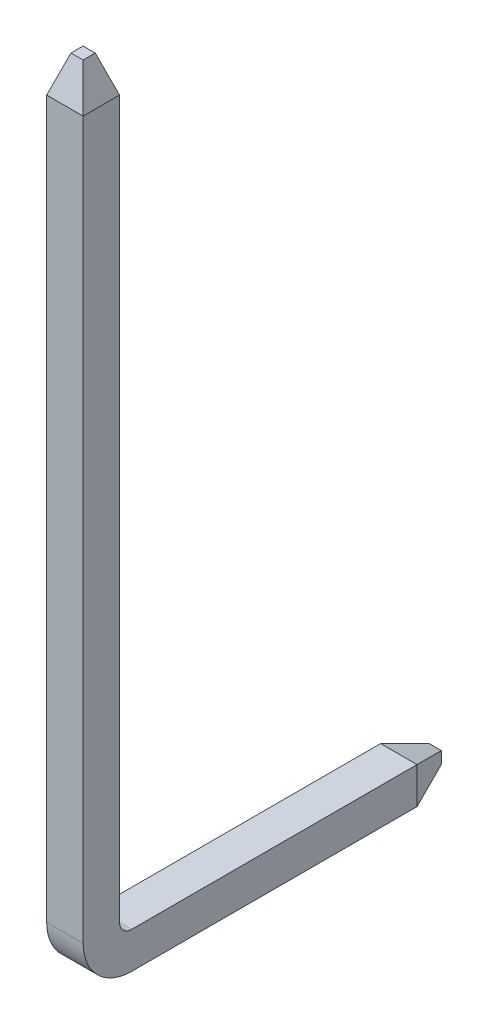
ISO-10303-21;
HEADER;
FILE_DESCRIPTION(('STEP AP214'),'2;1');
FILE_NAME('part.step','',(''),(''),'','','');
FILE_SCHEMA(('AUTOMOTIVE_DESIGN { 1 0 10303 214 1 1 1 1 }'));
ENDSEC;
DATA;
#1=APPLICATION_CONTEXT('core data for automotive mechanical design processes');
#2=APPLICATION_PROTOCOL_DEFINITION('international standard','automotive_design',2000,#1);
#3=PRODUCT_CONTEXT('',#1,'mechanical');
#4=PRODUCT('Part','Part','',(#3));
#5=PRODUCT_RELATED_PRODUCT_CATEGORY('part','',(#4));
#6=PRODUCT_DEFINITION_FORMATION('','',#4);
#7=PRODUCT_DEFINITION_CONTEXT('part definition',#1,'design');
#8=PRODUCT_DEFINITION('design','',#6,#7);
#9=PRODUCT_DEFINITION_SHAPE('','',#8);
#10=(LENGTH_UNIT() NAMED_UNIT(*) SI_UNIT(.MILLI.,.METRE.));
#11=(NAMED_UNIT(*) PLANE_ANGLE_UNIT() SI_UNIT($,.RADIAN.));
#12=(NAMED_UNIT(*) SI_UNIT($,.STERADIAN.) SOLID_ANGLE_UNIT());
#13=UNCERTAINTY_MEASURE_WITH_UNIT(LENGTH_MEASURE(1.E-05),#10,'distance_accuracy_value','');
#14=(GEOMETRIC_REPRESENTATION_CONTEXT(3) GLOBAL_UNCERTAINTY_ASSIGNED_CONTEXT((#13)) GLOBAL_UNIT_ASSIGNED_CONTEXT((#10,
#11,#12)) REPRESENTATION_CONTEXT('',''));
#15=CARTESIAN_POINT('',(0.,0.,0.));
#16=DIRECTION('',(0.,0.,1.));
#17=DIRECTION('',(1.,0.,0.));
#18=AXIS2_PLACEMENT_3D('',#15,#16,#17);
#19=CARTESIAN_POINT('',(0.6,12.6,0.));
#20=DIRECTION('',(0.,-1.,0.));
#21=DIRECTION('',(0.,0.,-1.));
#22=AXIS2_PLACEMENT_3D('',#19,#20,#21);
#23=PLANE('',#22);
#24=DIRECTION('',(0.,0.,1.));
#25=VECTOR('',#24,1.);
#26=CARTESIAN_POINT('',(0.2,12.6,0.));
#27=LINE('',#26,#25);
#28=CARTESIAN_POINT('',(0.2,12.6,0.2));
#29=VERTEX_POINT('',#28);
#30=CARTESIAN_POINT('',(0.2,12.6,0.4));
#31=VERTEX_POINT('',#30);
#32=EDGE_CURVE('E58',#29,#31,#27,.T.);
#33=ORIENTED_EDGE('',*,*,#32,.T.);
#34=DIRECTION('',(1.,0.,0.));
#35=VECTOR('',#34,1.);
#36=CARTESIAN_POINT('',(0.6,12.6,0.4));
#37=LINE('',#36,#35);
#38=CARTESIAN_POINT('',(0.4,12.6,0.4));
#39=VERTEX_POINT('',#38);
#40=EDGE_CURVE('E50',#31,#39,#37,.T.);
#41=ORIENTED_EDGE('',*,*,#40,.T.);
#42=DIRECTION('',(0.,0.,-1.));
#43=VECTOR('',#42,1.);
#44=CARTESIAN_POINT('',(0.4,12.6,0.));
#45=LINE('',#44,#43);
#46=CARTESIAN_POINT('',(0.4,12.6,0.2));
#47=VERTEX_POINT('',#46);
#48=EDGE_CURVE('E243',#39,#47,#45,.T.);
#49=ORIENTED_EDGE('',*,*,#48,.T.);
#50=DIRECTION('',(-1.,0.,0.));
#51=VECTOR('',#50,1.);
#52=CARTESIAN_POINT('',(0.6,12.6,0.2));
#53=LINE('',#52,#51);
#54=EDGE_CURVE('E63',#47,#29,#53,.T.);
#55=ORIENTED_EDGE('',*,*,#54,.T.);
#56=EDGE_LOOP('',(#33,#41,#49,#55));
#57=FACE_BOUND('',#56,.T.);
#58=ADVANCED_FACE('F41',(#57),#23,.F.);
#59=CARTESIAN_POINT('',(0.6,12.6,0.6));
#60=DIRECTION('',(0.,0.,-1.));
#61=DIRECTION('',(0.,1.,0.));
#62=AXIS2_PLACEMENT_3D('',#59,#60,#61);
#63=PLANE('',#62);
#64=DIRECTION('',(0.,-1.,0.));
#65=VECTOR('',#64,1.);
#66=CARTESIAN_POINT('',(0.6,12.6,0.6));
#67=LINE('',#66,#65);
#68=CARTESIAN_POINT('',(0.6,12.,0.6));
#69=VERTEX_POINT('',#68);
#70=CARTESIAN_POINT('',(0.6,0.200000000000006,0.599999999999999));
#71=VERTEX_POINT('',#70);
#72=EDGE_CURVE('E142',#69,#71,#67,.T.);
#73=ORIENTED_EDGE('',*,*,#72,.F.);
#74=DIRECTION('',(-1.,0.,0.));
#75=VECTOR('',#74,1.);
#76=CARTESIAN_POINT('',(0.6,12.,0.6));
#77=LINE('',#76,#75);
#78=CARTESIAN_POINT('',(0.,12.,0.6));
#79=VERTEX_POINT('',#78);
#80=EDGE_CURVE('E241',#69,#79,#77,.T.);
#81=ORIENTED_EDGE('',*,*,#80,.T.);
#82=DIRECTION('',(0.,-1.,0.));
#83=VECTOR('',#82,1.);
#84=CARTESIAN_POINT('',(0.,12.6,0.6));
#85=LINE('',#84,#83);
#86=CARTESIAN_POINT('',(0.,0.200000000000006,0.599999999999999));
#87=VERTEX_POINT('',#86);
#88=EDGE_CURVE('E161',#79,#87,#85,.T.);
#89=ORIENTED_EDGE('',*,*,#88,.T.);
#90=DIRECTION('',(-1.,0.,0.));
#91=VECTOR('',#90,1.);
#92=CARTESIAN_POINT('',(0.6,0.200000000000006,0.599999999999999));
#93=LINE('',#92,#91);
#94=EDGE_CURVE('E158',#71,#87,#93,.T.);
#95=ORIENTED_EDGE('',*,*,#94,.F.);
#96=EDGE_LOOP('',(#73,#81,#89,#95));
#97=FACE_BOUND('',#96,.T.);
#98=ADVANCED_FACE('F159',(#97),#63,.F.);
#99=CARTESIAN_POINT('',(0.6,0.2,-0.200000000000001));
#100=DIRECTION('',(-1.,0.,0.));
#101=DIRECTION('',(0.,0.,1.));
#102=AXIS2_PLACEMENT_3D('',#99,#100,#101);
#103=CYLINDRICAL_SURFACE('',#102,0.8);
#104=CARTESIAN_POINT('',(0.,0.2,-0.200000000000001));
#105=DIRECTION('',(1.,0.,0.));
#106=DIRECTION('',(0.,0.,-1.));
#107=AXIS2_PLACEMENT_3D('',#104,#105,#106);
#108=CIRCLE('',#107,0.8);
#109=CARTESIAN_POINT('',(0.,-0.6,-0.200000000000007));
#110=VERTEX_POINT('',#109);
#111=EDGE_CURVE('E187',#87,#110,#108,.T.);
#112=ORIENTED_EDGE('',*,*,#111,.T.);
#113=DIRECTION('',(-1.,0.,0.));
#114=VECTOR('',#113,1.);
#115=CARTESIAN_POINT('',(0.6,-0.6,-0.200000000000007));
#116=LINE('',#115,#114);
#117=CARTESIAN_POINT('',(0.6,-0.6,-0.200000000000007));
#118=VERTEX_POINT('',#117);
#119=EDGE_CURVE('E166',#118,#110,#116,.T.);
#120=ORIENTED_EDGE('',*,*,#119,.F.);
#121=CARTESIAN_POINT('',(0.6,0.2,-0.200000000000001));
#122=DIRECTION('',(1.,0.,0.));
#123=DIRECTION('',(0.,0.,-1.));
#124=AXIS2_PLACEMENT_3D('',#121,#122,#123);
#125=CIRCLE('',#124,0.8);
#126=EDGE_CURVE('E147',#71,#118,#125,.T.);
#127=ORIENTED_EDGE('',*,*,#126,.F.);
#128=ORIENTED_EDGE('',*,*,#94,.T.);
#129=EDGE_LOOP('',(#112,#120,#127,#128));
#130=FACE_BOUND('',#129,.T.);
#131=ADVANCED_FACE('F168',(#130),#103,.T.);
#132=CARTESIAN_POINT('',(0.6,-0.6,-0.200000000000007));
#133=DIRECTION('',(0.,1.,0.));
#134=DIRECTION('',(0.,0.,1.));
#135=AXIS2_PLACEMENT_3D('',#132,#133,#134);
#136=PLANE('',#135);
#137=DIRECTION('',(0.,0.,-1.));
#138=VECTOR('',#137,1.);
#139=CARTESIAN_POINT('',(0.,-0.6,-0.200000000000007));
#140=LINE('',#139,#138);
#141=CARTESIAN_POINT('',(0.,-0.599999999999999,-4.89999999999999));
#142=VERTEX_POINT('',#141);
#143=EDGE_CURVE('E191',#110,#142,#140,.T.);
#144=ORIENTED_EDGE('',*,*,#143,.T.);
#145=DIRECTION('',(1.,0.,0.));
#146=VECTOR('',#145,1.);
#147=CARTESIAN_POINT('',(0.6,-0.599999999999999,-4.89999999999999));
#148=LINE('',#147,#146);
#149=CARTESIAN_POINT('',(0.6,-0.599999999999999,-4.89999999999999));
#150=VERTEX_POINT('',#149);
#151=EDGE_CURVE('E231',#142,#150,#148,.T.);
#152=ORIENTED_EDGE('',*,*,#151,.T.);
#153=DIRECTION('',(0.,0.,-1.));
#154=VECTOR('',#153,1.);
#155=CARTESIAN_POINT('',(0.6,-0.6,-0.200000000000007));
#156=LINE('',#155,#154);
#157=EDGE_CURVE('E172',#118,#150,#156,.T.);
#158=ORIENTED_EDGE('',*,*,#157,.F.);
#159=ORIENTED_EDGE('',*,*,#119,.T.);
#160=EDGE_LOOP('',(#144,#152,#158,#159));
#161=FACE_BOUND('',#160,.T.);
#162=ADVANCED_FACE('F375',(#161),#136,.F.);
#163=CARTESIAN_POINT('',(0.6,-0.599999999999999,-5.5));
#164=DIRECTION('',(0.,0.,1.));
#165=DIRECTION('',(1.,0.,0.));
#166=AXIS2_PLACEMENT_3D('',#163,#164,#165);
#167=PLANE('',#166);
#168=DIRECTION('',(-1.,0.,0.));
#169=VECTOR('',#168,1.);
#170=CARTESIAN_POINT('',(0.6,-0.399999999999999,-5.5));
#171=LINE('',#170,#169);
#172=CARTESIAN_POINT('',(0.399999999999999,-0.399999999999999,-5.5));
#173=VERTEX_POINT('',#172);
#174=CARTESIAN_POINT('',(0.200000000000001,-0.399999999999999,-5.5));
#175=VERTEX_POINT('',#174);
#176=EDGE_CURVE('E218',#173,#175,#171,.T.);
#177=ORIENTED_EDGE('',*,*,#176,.T.);
#178=DIRECTION('',(0.,1.,0.));
#179=VECTOR('',#178,1.);
#180=CARTESIAN_POINT('',(0.200000000000001,-0.599999999999999,-5.5));
#181=LINE('',#180,#179);
#182=CARTESIAN_POINT('',(0.200000000000001,-0.2,-5.5));
#183=VERTEX_POINT('',#182);
#184=EDGE_CURVE('E221',#175,#183,#181,.T.);
#185=ORIENTED_EDGE('',*,*,#184,.T.);
#186=DIRECTION('',(1.,0.,0.));
#187=VECTOR('',#186,1.);
#188=CARTESIAN_POINT('',(0.6,-0.2,-5.5));
#189=LINE('',#188,#187);
#190=CARTESIAN_POINT('',(0.399999999999999,-0.2,-5.5));
#191=VERTEX_POINT('',#190);
#192=EDGE_CURVE('E215',#183,#191,#189,.T.);
#193=ORIENTED_EDGE('',*,*,#192,.T.);
#194=DIRECTION('',(0.,-1.,0.));
#195=VECTOR('',#194,1.);
#196=CARTESIAN_POINT('',(0.399999999999999,-0.599999999999999,-5.5));
#197=LINE('',#196,#195);
#198=EDGE_CURVE('E165',#191,#173,#197,.T.);
#199=ORIENTED_EDGE('',*,*,#198,.T.);
#200=EDGE_LOOP('',(#177,#185,#193,#199));
#201=FACE_BOUND('',#200,.T.);
#202=ADVANCED_FACE('F367',(#201),#167,.F.);
#203=CARTESIAN_POINT('',(0.6,0.,-5.5));
#204=DIRECTION('',(0.,-1.,0.));
#205=DIRECTION('',(0.,0.,-1.));
#206=AXIS2_PLACEMENT_3D('',#203,#204,#205);
#207=PLANE('',#206);
#208=DIRECTION('',(0.,0.,1.));
#209=VECTOR('',#208,1.);
#210=CARTESIAN_POINT('',(0.6,0.,-5.5));
#211=LINE('',#210,#209);
#212=CARTESIAN_POINT('',(0.6,0.,-4.89999999999999));
#213=VERTEX_POINT('',#212);
#214=CARTESIAN_POINT('',(0.6,0.,-0.200000000000001));
#215=VERTEX_POINT('',#214);
#216=EDGE_CURVE('E176',#213,#215,#211,.T.);
#217=ORIENTED_EDGE('',*,*,#216,.F.);
#218=DIRECTION('',(-1.,0.,0.));
#219=VECTOR('',#218,1.);
#220=CARTESIAN_POINT('',(0.6,0.,-4.89999999999999));
#221=LINE('',#220,#219);
#222=CARTESIAN_POINT('',(0.,0.,-4.89999999999999));
#223=VERTEX_POINT('',#222);
#224=EDGE_CURVE('E234',#213,#223,#221,.T.);
#225=ORIENTED_EDGE('',*,*,#224,.T.);
#226=DIRECTION('',(0.,0.,1.));
#227=VECTOR('',#226,1.);
#228=CARTESIAN_POINT('',(0.,0.,-5.5));
#229=LINE('',#228,#227);
#230=CARTESIAN_POINT('',(0.,0.,-0.200000000000001));
#231=VERTEX_POINT('',#230);
#232=EDGE_CURVE('E195',#223,#231,#229,.T.);
#233=ORIENTED_EDGE('',*,*,#232,.T.);
#234=DIRECTION('',(-1.,0.,0.));
#235=VECTOR('',#234,1.);
#236=CARTESIAN_POINT('',(0.6,0.,-0.200000000000001));
#237=LINE('',#236,#235);
#238=EDGE_CURVE('E207',#215,#231,#237,.T.);
#239=ORIENTED_EDGE('',*,*,#238,.F.);
#240=EDGE_LOOP('',(#217,#225,#233,#239));
#241=FACE_BOUND('',#240,.T.);
#242=ADVANCED_FACE('F359',(#241),#207,.F.);
#243=CARTESIAN_POINT('',(0.6,0.2,-0.2));
#244=DIRECTION('',(-1.,0.,0.));
#245=DIRECTION('',(0.,0.,1.));
#246=AXIS2_PLACEMENT_3D('',#243,#244,#245);
#247=CYLINDRICAL_SURFACE('',#246,0.2);
#248=CARTESIAN_POINT('',(0.,0.2,-0.2));
#249=DIRECTION('',(-1.,0.,0.));
#250=DIRECTION('',(0.,0.,-1.));
#251=AXIS2_PLACEMENT_3D('',#248,#249,#250);
#252=CIRCLE('',#251,0.2);
#253=CARTESIAN_POINT('',(0.,0.200000000000001,0.));
#254=VERTEX_POINT('',#253);
#255=EDGE_CURVE('E198',#231,#254,#252,.T.);
#256=ORIENTED_EDGE('',*,*,#255,.T.);
#257=DIRECTION('',(-1.,0.,0.));
#258=VECTOR('',#257,1.);
#259=CARTESIAN_POINT('',(0.6,0.200000000000001,0.));
#260=LINE('',#259,#258);
#261=CARTESIAN_POINT('',(0.6,0.200000000000001,0.));
#262=VERTEX_POINT('',#261);
#263=EDGE_CURVE('E185',#262,#254,#260,.T.);
#264=ORIENTED_EDGE('',*,*,#263,.F.);
#265=CARTESIAN_POINT('',(0.6,0.2,-0.2));
#266=DIRECTION('',(-1.,0.,0.));
#267=DIRECTION('',(0.,0.,-1.));
#268=AXIS2_PLACEMENT_3D('',#265,#266,#267);
#269=CIRCLE('',#268,0.2);
#270=EDGE_CURVE('E181',#215,#262,#269,.T.);
#271=ORIENTED_EDGE('',*,*,#270,.F.);
#272=ORIENTED_EDGE('',*,*,#238,.T.);
#273=EDGE_LOOP('',(#256,#264,#271,#272));
#274=FACE_BOUND('',#273,.T.);
#275=ADVANCED_FACE('F350',(#274),#247,.F.);
#276=CARTESIAN_POINT('',(0.6,0.200000000000001,0.));
#277=DIRECTION('',(0.,0.,1.));
#278=DIRECTION('',(0.,-1.,0.));
#279=AXIS2_PLACEMENT_3D('',#276,#277,#278);
#280=PLANE('',#279);
#281=DIRECTION('',(0.,1.,0.));
#282=VECTOR('',#281,1.);
#283=CARTESIAN_POINT('',(0.,0.200000000000001,0.));
#284=LINE('',#283,#282);
#285=CARTESIAN_POINT('',(0.,12.,0.));
#286=VERTEX_POINT('',#285);
#287=EDGE_CURVE('E155',#254,#286,#284,.T.);
#288=ORIENTED_EDGE('',*,*,#287,.T.);
#289=DIRECTION('',(1.,0.,0.));
#290=VECTOR('',#289,1.);
#291=CARTESIAN_POINT('',(0.6,12.,0.));
#292=LINE('',#291,#290);
#293=CARTESIAN_POINT('',(0.6,12.,0.));
#294=VERTEX_POINT('',#293);
#295=EDGE_CURVE('E11',#286,#294,#292,.T.);
#296=ORIENTED_EDGE('',*,*,#295,.T.);
#297=DIRECTION('',(0.,1.,0.));
#298=VECTOR('',#297,1.);
#299=CARTESIAN_POINT('',(0.6,0.200000000000001,0.));
#300=LINE('',#299,#298);
#301=EDGE_CURVE('E183',#262,#294,#300,.T.);
#302=ORIENTED_EDGE('',*,*,#301,.F.);
#303=ORIENTED_EDGE('',*,*,#263,.T.);
#304=EDGE_LOOP('',(#288,#296,#302,#303));
#305=FACE_BOUND('',#304,.T.);
#306=ADVANCED_FACE('F343',(#305),#280,.F.);
#307=CARTESIAN_POINT('',(0.6,0.2,-0.200000000000001));
#308=DIRECTION('',(1.,0.,0.));
#309=DIRECTION('',(0.,0.,-1.));
#310=AXIS2_PLACEMENT_3D('',#307,#308,#309);
#311=PLANE('',#310);
#312=ORIENTED_EDGE('',*,*,#157,.T.);
#313=DIRECTION('',(0.,1.,0.));
#314=VECTOR('',#313,1.);
#315=CARTESIAN_POINT('',(0.6,0.,-4.89999999999999));
#316=LINE('',#315,#314);
#317=EDGE_CURVE('E238',#150,#213,#316,.T.);
#318=ORIENTED_EDGE('',*,*,#317,.T.);
#319=ORIENTED_EDGE('',*,*,#216,.T.);
#320=ORIENTED_EDGE('',*,*,#270,.T.);
#321=ORIENTED_EDGE('',*,*,#301,.T.);
#322=DIRECTION('',(0.,0.,1.));
#323=VECTOR('',#322,1.);
#324=CARTESIAN_POINT('',(0.6,12.,0.6));
#325=LINE('',#324,#323);
#326=EDGE_CURVE('E151',#294,#69,#325,.T.);
#327=ORIENTED_EDGE('',*,*,#326,.T.);
#328=ORIENTED_EDGE('',*,*,#72,.T.);
#329=ORIENTED_EDGE('',*,*,#126,.T.);
#330=EDGE_LOOP('',(#312,#318,#319,#320,#321,#327,#328,#329));
#331=FACE_BOUND('',#330,.T.);
#332=ADVANCED_FACE('F145',(#331),#311,.T.);
#333=CARTESIAN_POINT('',(0.,0.2,-0.200000000000001));
#334=DIRECTION('',(1.,0.,0.));
#335=DIRECTION('',(0.,0.,-1.));
#336=AXIS2_PLACEMENT_3D('',#333,#334,#335);
#337=PLANE('',#336);
#338=ORIENTED_EDGE('',*,*,#232,.F.);
#339=DIRECTION('',(0.,-1.,0.));
#340=VECTOR('',#339,1.);
#341=CARTESIAN_POINT('',(0.,0.2,-4.89999999999999));
#342=LINE('',#341,#340);
#343=EDGE_CURVE('E227',#223,#142,#342,.T.);
#344=ORIENTED_EDGE('',*,*,#343,.T.);
#345=ORIENTED_EDGE('',*,*,#143,.F.);
#346=ORIENTED_EDGE('',*,*,#111,.F.);
#347=ORIENTED_EDGE('',*,*,#88,.F.);
#348=DIRECTION('',(0.,0.,-1.));
#349=VECTOR('',#348,1.);
#350=CARTESIAN_POINT('',(0.,12.,-0.200000000000001));
#351=LINE('',#350,#349);
#352=EDGE_CURVE('E225',#79,#286,#351,.T.);
#353=ORIENTED_EDGE('',*,*,#352,.T.);
#354=ORIENTED_EDGE('',*,*,#287,.F.);
#355=ORIENTED_EDGE('',*,*,#255,.F.);
#356=EDGE_LOOP('',(#338,#344,#345,#346,#347,#353,#354,#355));
#357=FACE_BOUND('',#356,.T.);
#358=ADVANCED_FACE('F303',(#357),#337,.F.);
#359=CARTESIAN_POINT('',(0.6,0.2,-4.89999999999999));
#360=DIRECTION('',(0.948683298050515,0.,-0.316227766016835));
#361=DIRECTION('',(0.,-1.,0.));
#362=AXIS2_PLACEMENT_3D('',#359,#360,#361);
#363=PLANE('',#362);
#364=DIRECTION('',(-0.301511344577761,-0.301511344577761,-0.904534033733292));
#365=VECTOR('',#364,1.);
#366=CARTESIAN_POINT('',(0.618181818181818,0.0181818181818185,-4.84545454545454));
#367=LINE('',#366,#365);
#368=EDGE_CURVE('E254',#213,#191,#367,.T.);
#369=ORIENTED_EDGE('',*,*,#368,.F.);
#370=ORIENTED_EDGE('',*,*,#317,.F.);
#371=DIRECTION('',(0.301511344577761,-0.301511344577762,0.904534033733292));
#372=VECTOR('',#371,1.);
#373=CARTESIAN_POINT('',(0.527272727272728,-0.527272727272728,-5.11818181818181));
#374=LINE('',#373,#372);
#375=EDGE_CURVE('E188',#173,#150,#374,.T.);
#376=ORIENTED_EDGE('',*,*,#375,.F.);
#377=ORIENTED_EDGE('',*,*,#198,.F.);
#378=EDGE_LOOP('',(#369,#370,#376,#377));
#379=FACE_BOUND('',#378,.T.);
#380=ADVANCED_FACE('F299',(#379),#363,.T.);
#381=CARTESIAN_POINT('',(0.6,-0.399999999999999,-5.5));
#382=DIRECTION('',(0.,0.948683298050515,0.316227766016836));
#383=DIRECTION('',(-1.,0.,0.));
#384=AXIS2_PLACEMENT_3D('',#381,#382,#383);
#385=PLANE('',#384);
#386=ORIENTED_EDGE('',*,*,#375,.T.);
#387=ORIENTED_EDGE('',*,*,#151,.F.);
#388=DIRECTION('',(0.301511344577761,0.301511344577762,-0.904534033733292));
#389=VECTOR('',#388,1.);
#390=CARTESIAN_POINT('',(0.236363636363636,-0.363636363636363,-5.60909090909091));
#391=LINE('',#390,#389);
#392=EDGE_CURVE('E251',#175,#142,#391,.F.);
#393=ORIENTED_EDGE('',*,*,#392,.F.);
#394=ORIENTED_EDGE('',*,*,#176,.F.);
#395=EDGE_LOOP('',(#386,#387,#393,#394));
#396=FACE_BOUND('',#395,.T.);
#397=ADVANCED_FACE('F295',(#396),#385,.F.);
#398=CARTESIAN_POINT('',(0.6,0.,-4.89999999999999));
#399=DIRECTION('',(0.,-0.948683298050515,0.316227766016835));
#400=DIRECTION('',(-1.,0.,0.));
#401=AXIS2_PLACEMENT_3D('',#398,#399,#400);
#402=PLANE('',#401);
#403=ORIENTED_EDGE('',*,*,#368,.T.);
#404=ORIENTED_EDGE('',*,*,#192,.F.);
#405=DIRECTION('',(-0.301511344577761,0.301511344577761,0.904534033733292));
#406=VECTOR('',#405,1.);
#407=CARTESIAN_POINT('',(0.0545454545454538,-0.0545454545454531,-5.06363636363636));
#408=LINE('',#407,#406);
#409=EDGE_CURVE('E248',#223,#183,#408,.F.);
#410=ORIENTED_EDGE('',*,*,#409,.F.);
#411=ORIENTED_EDGE('',*,*,#224,.F.);
#412=EDGE_LOOP('',(#403,#404,#410,#411));
#413=FACE_BOUND('',#412,.T.);
#414=ADVANCED_FACE('F291',(#413),#402,.F.);
#415=CARTESIAN_POINT('',(0.200000000000001,-0.599999999999999,-5.5));
#416=DIRECTION('',(0.948683298050515,0.,0.316227766016835));
#417=DIRECTION('',(0.,1.,0.));
#418=AXIS2_PLACEMENT_3D('',#415,#416,#417);
#419=PLANE('',#418);
#420=ORIENTED_EDGE('',*,*,#392,.T.);
#421=ORIENTED_EDGE('',*,*,#343,.F.);
#422=ORIENTED_EDGE('',*,*,#409,.T.);
#423=ORIENTED_EDGE('',*,*,#184,.F.);
#424=EDGE_LOOP('',(#420,#421,#422,#423));
#425=FACE_BOUND('',#424,.T.);
#426=ADVANCED_FACE('F288',(#425),#419,.F.);
#427=CARTESIAN_POINT('',(0.6,12.6,0.2));
#428=DIRECTION('',(0.,-0.316227766016836,0.948683298050514));
#429=DIRECTION('',(-1.,0.,0.));
#430=AXIS2_PLACEMENT_3D('',#427,#428,#429);
#431=PLANE('',#430);
#432=DIRECTION('',(0.301511344577762,0.904534033733292,0.301511344577762));
#433=VECTOR('',#432,1.);
#434=CARTESIAN_POINT('',(0.236363636363636,12.7090909090909,0.236363636363636));
#435=LINE('',#434,#433);
#436=EDGE_CURVE('E264',#29,#286,#435,.F.);
#437=ORIENTED_EDGE('',*,*,#436,.F.);
#438=ORIENTED_EDGE('',*,*,#54,.F.);
#439=DIRECTION('',(0.301511344577762,-0.904534033733292,-0.301511344577762));
#440=VECTOR('',#439,1.);
#441=CARTESIAN_POINT('',(0.618181818181818,11.9454545454545,-0.0181818181818181));
#442=LINE('',#441,#440);
#443=EDGE_CURVE('E45',#294,#47,#442,.F.);
#444=ORIENTED_EDGE('',*,*,#443,.F.);
#445=ORIENTED_EDGE('',*,*,#295,.F.);
#446=EDGE_LOOP('',(#437,#438,#444,#445));
#447=FACE_BOUND('',#446,.T.);
#448=ADVANCED_FACE('F43',(#447),#431,.F.);
#449=CARTESIAN_POINT('',(0.6,12.,-0.200000000000001));
#450=DIRECTION('',(0.948683298050514,0.316227766016836,0.));
#451=DIRECTION('',(0.,0.,-1.));
#452=AXIS2_PLACEMENT_3D('',#449,#450,#451);
#453=PLANE('',#452);
#454=ORIENTED_EDGE('',*,*,#443,.T.);
#455=ORIENTED_EDGE('',*,*,#48,.F.);
#456=DIRECTION('',(-0.301511344577762,0.904534033733292,-0.301511344577762));
#457=VECTOR('',#456,1.);
#458=CARTESIAN_POINT('',(0.527272727272728,12.2181818181818,0.527272727272728));
#459=LINE('',#458,#457);
#460=EDGE_CURVE('E263',#69,#39,#459,.T.);
#461=ORIENTED_EDGE('',*,*,#460,.F.);
#462=ORIENTED_EDGE('',*,*,#326,.F.);
#463=EDGE_LOOP('',(#454,#455,#461,#462));
#464=FACE_BOUND('',#463,.T.);
#465=ADVANCED_FACE('F272',(#464),#453,.T.);
#466=CARTESIAN_POINT('',(0.2,12.6,0.));
#467=DIRECTION('',(0.948683298050514,-0.316227766016836,0.));
#468=DIRECTION('',(0.,0.,1.));
#469=AXIS2_PLACEMENT_3D('',#466,#467,#468);
#470=PLANE('',#469);
#471=ORIENTED_EDGE('',*,*,#436,.T.);
#472=ORIENTED_EDGE('',*,*,#352,.F.);
#473=DIRECTION('',(0.301511344577762,0.904534033733292,-0.301511344577762));
#474=VECTOR('',#473,1.);
#475=CARTESIAN_POINT('',(0.236363636363636,12.7090909090909,0.363636363636364));
#476=LINE('',#475,#474);
#477=EDGE_CURVE('E261',#31,#79,#476,.F.);
#478=ORIENTED_EDGE('',*,*,#477,.F.);
#479=ORIENTED_EDGE('',*,*,#32,.F.);
#480=EDGE_LOOP('',(#471,#472,#478,#479));
#481=FACE_BOUND('',#480,.T.);
#482=ADVANCED_FACE('F276',(#481),#470,.F.);
#483=CARTESIAN_POINT('',(0.6,12.,0.6));
#484=DIRECTION('',(0.,-0.316227766016836,-0.948683298050514));
#485=DIRECTION('',(-1.,0.,0.));
#486=AXIS2_PLACEMENT_3D('',#483,#484,#485);
#487=PLANE('',#486);
#488=ORIENTED_EDGE('',*,*,#460,.T.);
#489=ORIENTED_EDGE('',*,*,#40,.F.);
#490=ORIENTED_EDGE('',*,*,#477,.T.);
#491=ORIENTED_EDGE('',*,*,#80,.F.);
#492=EDGE_LOOP('',(#488,#489,#490,#491));
#493=FACE_BOUND('',#492,.T.);
#494=ADVANCED_FACE('F279',(#493),#487,.F.);
#495=CLOSED_SHELL('',(#58,#98,#131,#162,#202,#242,#275,#306,#332,#358,#380,#397,#414,#426,#448,
#465,#482,#494));
#496=MANIFOLD_SOLID_BREP('B2',#495);
#497=ADVANCED_BREP_SHAPE_REPRESENTATION('',(#18,#496),#14);
#498=SHAPE_DEFINITION_REPRESENTATION(#9,#497);
ENDSEC;
END-ISO-10303-21;
